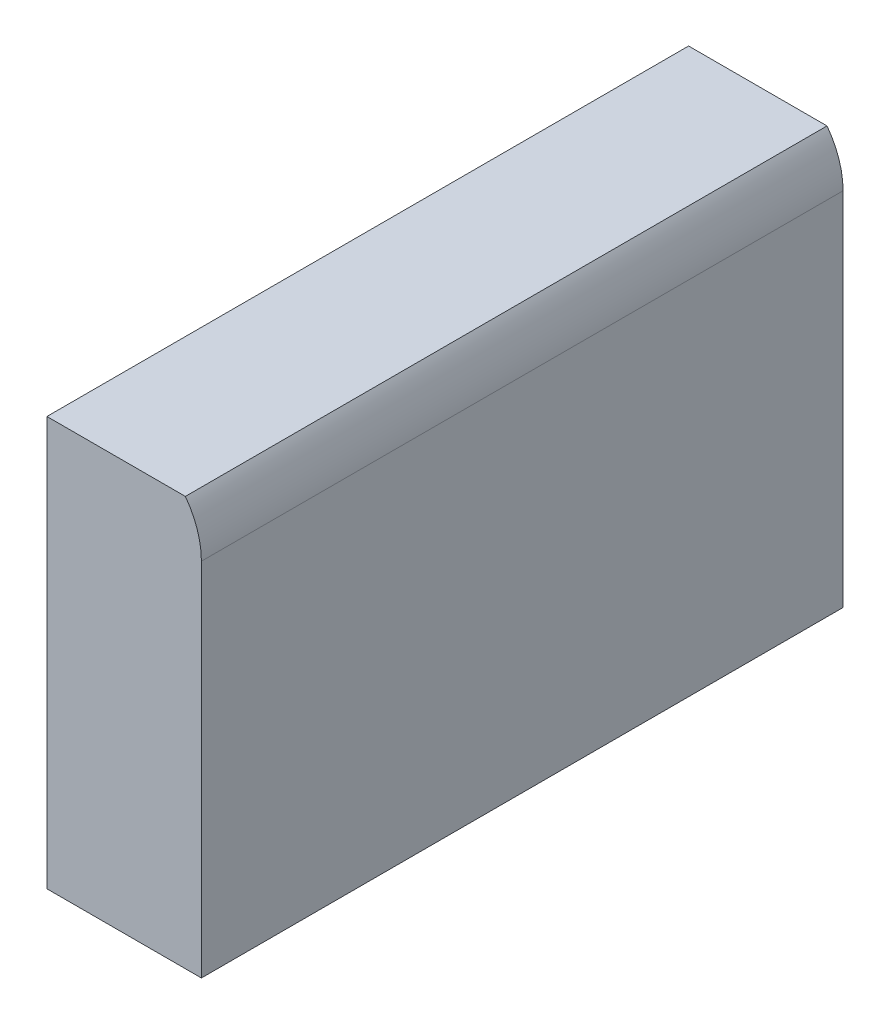
ISO-10303-21;
HEADER;
FILE_DESCRIPTION(('STEP AP214'),'2;1');
FILE_NAME('part.step','',(''),(''),'','','');
FILE_SCHEMA(('AUTOMOTIVE_DESIGN { 1 0 10303 214 1 1 1 1 }'));
ENDSEC;
DATA;
#1=APPLICATION_CONTEXT('core data for automotive mechanical design processes');
#2=APPLICATION_PROTOCOL_DEFINITION('international standard','automotive_design',2000,#1);
#3=PRODUCT_CONTEXT('',#1,'mechanical');
#4=PRODUCT('Part','Part','',(#3));
#5=PRODUCT_RELATED_PRODUCT_CATEGORY('part','',(#4));
#6=PRODUCT_DEFINITION_FORMATION('','',#4);
#7=PRODUCT_DEFINITION_CONTEXT('part definition',#1,'design');
#8=PRODUCT_DEFINITION('design','',#6,#7);
#9=PRODUCT_DEFINITION_SHAPE('','',#8);
#10=(LENGTH_UNIT() NAMED_UNIT(*) SI_UNIT(.MILLI.,.METRE.));
#11=(NAMED_UNIT(*) PLANE_ANGLE_UNIT() SI_UNIT($,.RADIAN.));
#12=(NAMED_UNIT(*) SI_UNIT($,.STERADIAN.) SOLID_ANGLE_UNIT());
#13=UNCERTAINTY_MEASURE_WITH_UNIT(LENGTH_MEASURE(1.E-05),#10,'distance_accuracy_value','');
#14=(GEOMETRIC_REPRESENTATION_CONTEXT(3) GLOBAL_UNCERTAINTY_ASSIGNED_CONTEXT((#13)) GLOBAL_UNIT_ASSIGNED_CONTEXT((#10,
#11,#12)) REPRESENTATION_CONTEXT('',''));
#15=CARTESIAN_POINT('',(0.,0.,0.));
#16=DIRECTION('',(0.,0.,1.));
#17=DIRECTION('',(1.,0.,0.));
#18=AXIS2_PLACEMENT_3D('',#15,#16,#17);
#19=CARTESIAN_POINT('',(2.15,1.473243270144,-3.576638984981E-11));
#20=DIRECTION('',(1.,0.,0.));
#21=DIRECTION('',(0.,1.,0.));
#22=AXIS2_PLACEMENT_3D('',#19,#20,#21);
#23=PLANE('',#22);
#24=DIRECTION('',(0.,0.,-1.));
#25=VECTOR('',#24,1.);
#26=CARTESIAN_POINT('',(2.15,1.650056147,1.011149099852));
#27=LINE('',#26,#25);
#28=CARTESIAN_POINT('',(2.14999999961,1.650056147,0.399999999964));
#29=VERTEX_POINT('',#28);
#30=CARTESIAN_POINT('',(2.15,1.650056147,-0.400000000036));
#31=VERTEX_POINT('',#30);
#32=EDGE_CURVE('E11',#29,#31,#27,.T.);
#33=ORIENTED_EDGE('',*,*,#32,.T.);
#34=DIRECTION('',(0.,-1.,0.));
#35=VECTOR('',#34,1.);
#36=CARTESIAN_POINT('',(2.14999999961,1.690056146978,-0.400000000036));
#37=LINE('',#36,#35);
#38=CARTESIAN_POINT('',(2.14999999961,1.14005614774,-0.400000000036));
#39=VERTEX_POINT('',#38);
#40=EDGE_CURVE('E27',#31,#39,#37,.T.);
#41=ORIENTED_EDGE('',*,*,#40,.T.);
#42=DIRECTION('',(0.,0.,1.));
#43=VECTOR('',#42,1.);
#44=CARTESIAN_POINT('',(2.15,1.14005614774,-0.212500000018));
#45=LINE('',#44,#43);
#46=CARTESIAN_POINT('',(2.14999999961,1.14005614774,0.399999999964));
#47=VERTEX_POINT('',#46);
#48=EDGE_CURVE('E107',#39,#47,#45,.T.);
#49=ORIENTED_EDGE('',*,*,#48,.T.);
#50=DIRECTION('',(0.,-1.,0.));
#51=VECTOR('',#50,1.);
#52=CARTESIAN_POINT('',(2.14999999961,1.690056146978,0.399999999964));
#53=LINE('',#52,#51);
#54=EDGE_CURVE('E95',#29,#47,#53,.T.);
#55=ORIENTED_EDGE('',*,*,#54,.F.);
#56=EDGE_LOOP('',(#33,#41,#49,#55));
#57=FACE_BOUND('',#56,.T.);
#58=ADVANCED_FACE('F16',(#57),#23,.F.);
#59=CARTESIAN_POINT('',(-2.585174526508,1.650056147,2.022298199739));
#60=DIRECTION('',(0.,1.,0.));
#61=DIRECTION('',(1.,0.,0.));
#62=AXIS2_PLACEMENT_3D('',#59,#60,#61);
#63=PLANE('',#62);
#64=ORIENTED_EDGE('',*,*,#32,.F.);
#65=DIRECTION('',(1.,0.,0.));
#66=VECTOR('',#65,1.);
#67=CARTESIAN_POINT('',(2.34258858761,1.650056147,0.399999999964));
#68=LINE('',#67,#66);
#69=CARTESIAN_POINT('',(2.322588587997,1.650056147,0.399999999964));
#70=VERTEX_POINT('',#69);
#71=EDGE_CURVE('E99',#29,#70,#68,.T.);
#72=ORIENTED_EDGE('',*,*,#71,.T.);
#73=DIRECTION('',(0.,0.,1.));
#74=VECTOR('',#73,1.);
#75=CARTESIAN_POINT('',(2.322588587997,1.650056147,-1.475774863));
#76=LINE('',#75,#74);
#77=CARTESIAN_POINT('',(2.322588587997,1.650056147,-0.400000000036));
#78=VERTEX_POINT('',#77);
#79=EDGE_CURVE('E122',#78,#70,#76,.T.);
#80=ORIENTED_EDGE('',*,*,#79,.F.);
#81=DIRECTION('',(-1.,0.,0.));
#82=VECTOR('',#81,1.);
#83=CARTESIAN_POINT('',(2.14999999961,1.650056147,-0.400000000036));
#84=LINE('',#83,#82);
#85=EDGE_CURVE('E62',#78,#31,#84,.T.);
#86=ORIENTED_EDGE('',*,*,#85,.T.);
#87=EDGE_LOOP('',(#64,#72,#80,#86));
#88=FACE_BOUND('',#87,.T.);
#89=ADVANCED_FACE('F157',(#88),#63,.T.);
#90=CARTESIAN_POINT('',(2.14999999961,1.690056146978,-0.400000000036));
#91=DIRECTION('',(0.,0.,1.));
#92=DIRECTION('',(1.,0.,0.));
#93=AXIS2_PLACEMENT_3D('',#90,#91,#92);
#94=PLANE('',#93);
#95=ORIENTED_EDGE('',*,*,#85,.F.);
#96=CARTESIAN_POINT('',(2.242588588384,1.590056147774,-0.400000000036));
#97=DIRECTION('',(0.,0.,-1.));
#98=DIRECTION('',(1.,0.,0.));
#99=AXIS2_PLACEMENT_3D('',#96,#97,#98);
#100=CIRCLE('',#99,0.0999999992264901);
#101=CARTESIAN_POINT('',(2.34258858761,1.590056147774,-0.400000000036));
#102=VERTEX_POINT('',#101);
#103=EDGE_CURVE('E120',#78,#102,#100,.T.);
#104=ORIENTED_EDGE('',*,*,#103,.T.);
#105=DIRECTION('',(0.,-1.,0.));
#106=VECTOR('',#105,1.);
#107=CARTESIAN_POINT('',(2.34258858761,1.690056146978,-0.400000000036));
#108=LINE('',#107,#106);
#109=CARTESIAN_POINT('',(2.34258858761,1.14005614774,-0.400000000036));
#110=VERTEX_POINT('',#109);
#111=EDGE_CURVE('E87',#102,#110,#108,.T.);
#112=ORIENTED_EDGE('',*,*,#111,.T.);
#113=DIRECTION('',(-1.,0.,0.));
#114=VECTOR('',#113,1.);
#115=CARTESIAN_POINT('',(2.14999999961,1.140056146978,-0.400000000036));
#116=LINE('',#115,#114);
#117=EDGE_CURVE('E112',#110,#39,#116,.T.);
#118=ORIENTED_EDGE('',*,*,#117,.T.);
#119=ORIENTED_EDGE('',*,*,#40,.F.);
#120=EDGE_LOOP('',(#95,#104,#112,#118,#119));
#121=FACE_BOUND('',#120,.T.);
#122=ADVANCED_FACE('F161',(#121),#94,.F.);
#123=CARTESIAN_POINT('',(2.34258858761,1.690056146978,0.399999999964));
#124=DIRECTION('',(0.,0.,-1.));
#125=DIRECTION('',(0.,-1.,0.));
#126=AXIS2_PLACEMENT_3D('',#123,#124,#125);
#127=PLANE('',#126);
#128=ORIENTED_EDGE('',*,*,#71,.F.);
#129=ORIENTED_EDGE('',*,*,#54,.T.);
#130=DIRECTION('',(1.,0.,0.));
#131=VECTOR('',#130,1.);
#132=CARTESIAN_POINT('',(2.34258858761,1.140056146978,0.399999999964));
#133=LINE('',#132,#131);
#134=CARTESIAN_POINT('',(2.34258858761,1.14005614774,0.399999999964));
#135=VERTEX_POINT('',#134);
#136=EDGE_CURVE('E97',#47,#135,#133,.T.);
#137=ORIENTED_EDGE('',*,*,#136,.T.);
#138=DIRECTION('',(0.,-1.,0.));
#139=VECTOR('',#138,1.);
#140=CARTESIAN_POINT('',(2.34258858761,1.690056146978,0.399999999964));
#141=LINE('',#140,#139);
#142=CARTESIAN_POINT('',(2.34258858761,1.590056147774,0.399999999964));
#143=VERTEX_POINT('',#142);
#144=EDGE_CURVE('E20',#143,#135,#141,.T.);
#145=ORIENTED_EDGE('',*,*,#144,.F.);
#146=CARTESIAN_POINT('',(2.242588588384,1.590056147774,0.399999999964));
#147=DIRECTION('',(0.,0.,1.));
#148=DIRECTION('',(-1.,0.,0.));
#149=AXIS2_PLACEMENT_3D('',#146,#147,#148);
#150=CIRCLE('',#149,0.0999999992264901);
#151=EDGE_CURVE('E75',#143,#70,#150,.T.);
#152=ORIENTED_EDGE('',*,*,#151,.T.);
#153=EDGE_LOOP('',(#128,#129,#137,#145,#152));
#154=FACE_BOUND('',#153,.T.);
#155=ADVANCED_FACE('F18',(#154),#127,.F.);
#156=CARTESIAN_POINT('',(2.242588588384,1.590056147774,-1.475774863));
#157=DIRECTION('',(0.,0.,1.));
#158=DIRECTION('',(1.,0.,0.));
#159=AXIS2_PLACEMENT_3D('',#156,#157,#158);
#160=CYLINDRICAL_SURFACE('',#159,0.0999999992264901);
#161=ORIENTED_EDGE('',*,*,#103,.F.);
#162=ORIENTED_EDGE('',*,*,#79,.T.);
#163=ORIENTED_EDGE('',*,*,#151,.F.);
#164=DIRECTION('',(0.,0.,1.));
#165=VECTOR('',#164,1.);
#166=CARTESIAN_POINT('',(2.34258858761,1.590056147774,0.399999999964));
#167=LINE('',#166,#165);
#168=EDGE_CURVE('E133',#102,#143,#167,.T.);
#169=ORIENTED_EDGE('',*,*,#168,.F.);
#170=EDGE_LOOP('',(#161,#162,#163,#169));
#171=FACE_BOUND('',#170,.T.);
#172=ADVANCED_FACE('F158',(#171),#160,.T.);
#173=CARTESIAN_POINT('',(2.34258858761,1.690056146978,-0.400000000036));
#174=DIRECTION('',(-1.,0.,0.));
#175=DIRECTION('',(0.,0.,1.));
#176=AXIS2_PLACEMENT_3D('',#173,#174,#175);
#177=PLANE('',#176);
#178=ORIENTED_EDGE('',*,*,#111,.F.);
#179=ORIENTED_EDGE('',*,*,#168,.T.);
#180=ORIENTED_EDGE('',*,*,#144,.T.);
#181=DIRECTION('',(0.,0.,1.));
#182=VECTOR('',#181,1.);
#183=CARTESIAN_POINT('',(2.34258858761,1.14005614774,-0.425));
#184=LINE('',#183,#182);
#185=EDGE_CURVE('E108',#110,#135,#184,.T.);
#186=ORIENTED_EDGE('',*,*,#185,.F.);
#187=EDGE_LOOP('',(#178,#179,#180,#186));
#188=FACE_BOUND('',#187,.T.);
#189=ADVANCED_FACE('F159',(#188),#177,.F.);
#190=CARTESIAN_POINT('',(2.09999999961,1.14005614774,-0.425));
#191=DIRECTION('',(0.,1.,0.));
#192=DIRECTION('',(0.,0.,-1.));
#193=AXIS2_PLACEMENT_3D('',#190,#191,#192);
#194=PLANE('',#193);
#195=ORIENTED_EDGE('',*,*,#48,.F.);
#196=ORIENTED_EDGE('',*,*,#117,.F.);
#197=ORIENTED_EDGE('',*,*,#185,.T.);
#198=ORIENTED_EDGE('',*,*,#136,.F.);
#199=EDGE_LOOP('',(#195,#196,#197,#198));
#200=FACE_BOUND('',#199,.T.);
#201=ADVANCED_FACE('F105',(#200),#194,.F.);
#202=CLOSED_SHELL('',(#58,#89,#122,#155,#172,#189,#201));
#203=MANIFOLD_SOLID_BREP('B1',#202);
#204=ADVANCED_BREP_SHAPE_REPRESENTATION('',(#18,#203),#14);
#205=SHAPE_DEFINITION_REPRESENTATION(#9,#204);
ENDSEC;
END-ISO-10303-21;
